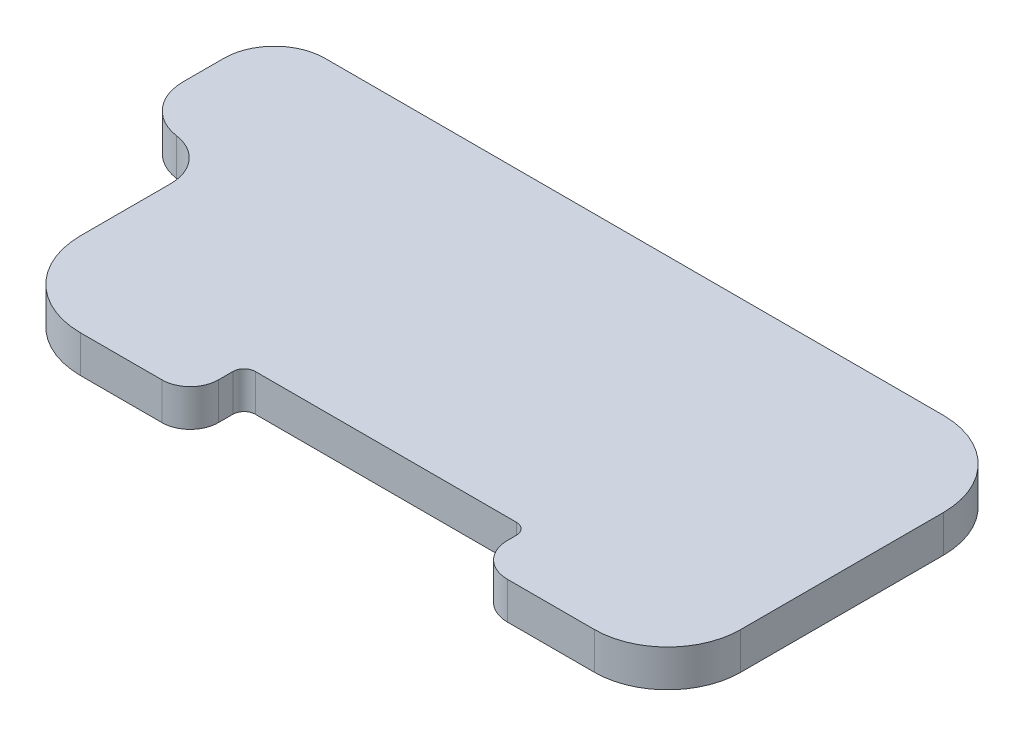
ISO-10303-21;
HEADER;
FILE_DESCRIPTION(('STEP AP214'),'2;1');
FILE_NAME('part.step','',(''),(''),'','','');
FILE_SCHEMA(('AUTOMOTIVE_DESIGN { 1 0 10303 214 1 1 1 1 }'));
ENDSEC;
DATA;
#1=APPLICATION_CONTEXT('core data for automotive mechanical design processes');
#2=APPLICATION_PROTOCOL_DEFINITION('international standard','automotive_design',2000,#1);
#3=PRODUCT_CONTEXT('',#1,'mechanical');
#4=PRODUCT('Part','Part','',(#3));
#5=PRODUCT_RELATED_PRODUCT_CATEGORY('part','',(#4));
#6=PRODUCT_DEFINITION_FORMATION('','',#4);
#7=PRODUCT_DEFINITION_CONTEXT('part definition',#1,'design');
#8=PRODUCT_DEFINITION('design','',#6,#7);
#9=PRODUCT_DEFINITION_SHAPE('','',#8);
#10=(LENGTH_UNIT() NAMED_UNIT(*) SI_UNIT(.MILLI.,.METRE.));
#11=(NAMED_UNIT(*) PLANE_ANGLE_UNIT() SI_UNIT($,.RADIAN.));
#12=(NAMED_UNIT(*) SI_UNIT($,.STERADIAN.) SOLID_ANGLE_UNIT());
#13=UNCERTAINTY_MEASURE_WITH_UNIT(LENGTH_MEASURE(1.E-05),#10,'distance_accuracy_value','');
#14=(GEOMETRIC_REPRESENTATION_CONTEXT(3) GLOBAL_UNCERTAINTY_ASSIGNED_CONTEXT((#13)) GLOBAL_UNIT_ASSIGNED_CONTEXT((#10,
#11,#12)) REPRESENTATION_CONTEXT('',''));
#15=CARTESIAN_POINT('',(0.,0.,0.));
#16=DIRECTION('',(0.,0.,1.));
#17=DIRECTION('',(1.,0.,0.));
#18=AXIS2_PLACEMENT_3D('',#15,#16,#17);
#19=CARTESIAN_POINT('',(0.,1.32,-5.05));
#20=DIRECTION('',(1.,0.,0.));
#21=DIRECTION('',(0.,0.,-1.));
#22=AXIS2_PLACEMENT_3D('',#19,#20,#21);
#23=PLANE('',#22);
#24=DIRECTION('',(0.,0.,1.));
#25=VECTOR('',#24,1.);
#26=CARTESIAN_POINT('',(0.,1.32,-5.05));
#27=LINE('',#26,#25);
#28=CARTESIAN_POINT('',(0.,1.32,-3.25));
#29=VERTEX_POINT('',#28);
#30=CARTESIAN_POINT('',(0.,1.32,-1.8));
#31=VERTEX_POINT('',#30);
#32=EDGE_CURVE('E209',#29,#31,#27,.T.);
#33=ORIENTED_EDGE('',*,*,#32,.F.);
#34=DIRECTION('',(0.,-1.,0.));
#35=VECTOR('',#34,1.);
#36=CARTESIAN_POINT('',(0.,1.32,-3.25));
#37=LINE('',#36,#35);
#38=CARTESIAN_POINT('',(0.,0.,-3.25));
#39=VERTEX_POINT('',#38);
#40=EDGE_CURVE('E274',#29,#39,#37,.T.);
#41=ORIENTED_EDGE('',*,*,#40,.T.);
#42=DIRECTION('',(0.,0.,1.));
#43=VECTOR('',#42,1.);
#44=CARTESIAN_POINT('',(0.,0.,-5.05));
#45=LINE('',#44,#43);
#46=CARTESIAN_POINT('',(0.,0.,-1.8));
#47=VERTEX_POINT('',#46);
#48=EDGE_CURVE('E195',#39,#47,#45,.T.);
#49=ORIENTED_EDGE('',*,*,#48,.T.);
#50=DIRECTION('',(0.,-1.,0.));
#51=VECTOR('',#50,1.);
#52=CARTESIAN_POINT('',(0.,1.32,-1.8));
#53=LINE('',#52,#51);
#54=EDGE_CURVE('E272',#47,#31,#53,.F.);
#55=ORIENTED_EDGE('',*,*,#54,.T.);
#56=EDGE_LOOP('',(#33,#41,#49,#55));
#57=FACE_BOUND('',#56,.T.);
#58=ADVANCED_FACE('F34',(#57),#23,.F.);
#59=CARTESIAN_POINT('',(2.92,1.32,0.));
#60=DIRECTION('',(1.,0.,0.));
#61=DIRECTION('',(0.,0.,-1.));
#62=AXIS2_PLACEMENT_3D('',#59,#60,#61);
#63=PLANE('',#62);
#64=DIRECTION('',(0.,0.,1.));
#65=VECTOR('',#64,1.);
#66=CARTESIAN_POINT('',(2.92,1.32,0.));
#67=LINE('',#66,#65);
#68=CARTESIAN_POINT('',(2.92,1.32,1.56594711782583));
#69=VERTEX_POINT('',#68);
#70=CARTESIAN_POINT('',(2.92,1.32,4.77));
#71=VERTEX_POINT('',#70);
#72=EDGE_CURVE('E294',#69,#71,#67,.T.);
#73=ORIENTED_EDGE('',*,*,#72,.F.);
#74=DIRECTION('',(0.,-1.,0.));
#75=VECTOR('',#74,1.);
#76=CARTESIAN_POINT('',(2.92,1.32,1.56594711782583));
#77=LINE('',#76,#75);
#78=CARTESIAN_POINT('',(2.92,0.,1.56594711782583));
#79=VERTEX_POINT('',#78);
#80=EDGE_CURVE('E287',#69,#79,#77,.T.);
#81=ORIENTED_EDGE('',*,*,#80,.T.);
#82=DIRECTION('',(0.,0.,1.));
#83=VECTOR('',#82,1.);
#84=CARTESIAN_POINT('',(2.92,0.,0.));
#85=LINE('',#84,#83);
#86=CARTESIAN_POINT('',(2.92,0.,4.77));
#87=VERTEX_POINT('',#86);
#88=EDGE_CURVE('E190',#79,#87,#85,.T.);
#89=ORIENTED_EDGE('',*,*,#88,.T.);
#90=DIRECTION('',(0.,-1.,0.));
#91=VECTOR('',#90,1.);
#92=CARTESIAN_POINT('',(2.92,1.32,4.77));
#93=LINE('',#92,#91);
#94=EDGE_CURVE('E171',#87,#71,#93,.F.);
#95=ORIENTED_EDGE('',*,*,#94,.T.);
#96=EDGE_LOOP('',(#73,#81,#89,#95));
#97=FACE_BOUND('',#96,.T.);
#98=ADVANCED_FACE('F293',(#97),#63,.F.);
#99=CARTESIAN_POINT('',(2.92,1.32,7.77));
#100=DIRECTION('',(0.,0.,-1.));
#101=DIRECTION('',(-1.,0.,0.));
#102=AXIS2_PLACEMENT_3D('',#99,#100,#101);
#103=PLANE('',#102);
#104=DIRECTION('',(1.,0.,0.));
#105=VECTOR('',#104,1.);
#106=CARTESIAN_POINT('',(2.92,0.,7.77));
#107=LINE('',#106,#105);
#108=CARTESIAN_POINT('',(5.92,0.,7.77));
#109=VERTEX_POINT('',#108);
#110=CARTESIAN_POINT('',(8.82,0.,7.77));
#111=VERTEX_POINT('',#110);
#112=EDGE_CURVE('E179',#109,#111,#107,.T.);
#113=ORIENTED_EDGE('',*,*,#112,.T.);
#114=DIRECTION('',(0.,-1.,0.));
#115=VECTOR('',#114,1.);
#116=CARTESIAN_POINT('',(8.82000000000001,1.32,7.77));
#117=LINE('',#116,#115);
#118=CARTESIAN_POINT('',(8.82,1.32,7.77));
#119=VERTEX_POINT('',#118);
#120=EDGE_CURVE('E242',#111,#119,#117,.F.);
#121=ORIENTED_EDGE('',*,*,#120,.T.);
#122=DIRECTION('',(1.,0.,0.));
#123=VECTOR('',#122,1.);
#124=CARTESIAN_POINT('',(2.92,1.32,7.77));
#125=LINE('',#124,#123);
#126=CARTESIAN_POINT('',(5.92,1.32,7.77));
#127=VERTEX_POINT('',#126);
#128=EDGE_CURVE('E182',#127,#119,#125,.T.);
#129=ORIENTED_EDGE('',*,*,#128,.F.);
#130=DIRECTION('',(0.,-1.,0.));
#131=VECTOR('',#130,1.);
#132=CARTESIAN_POINT('',(5.92,1.32,7.77));
#133=LINE('',#132,#131);
#134=EDGE_CURVE('E169',#127,#109,#133,.T.);
#135=ORIENTED_EDGE('',*,*,#134,.T.);
#136=EDGE_LOOP('',(#113,#121,#129,#135));
#137=FACE_BOUND('',#136,.T.);
#138=ADVANCED_FACE('F178',(#137),#103,.F.);
#139=CARTESIAN_POINT('',(9.82,1.32,7.77));
#140=DIRECTION('',(-1.,0.,0.));
#141=DIRECTION('',(0.,0.,1.));
#142=AXIS2_PLACEMENT_3D('',#139,#140,#141);
#143=PLANE('',#142);
#144=DIRECTION('',(0.,0.,-1.));
#145=VECTOR('',#144,1.);
#146=CARTESIAN_POINT('',(9.82,0.,7.77));
#147=LINE('',#146,#145);
#148=CARTESIAN_POINT('',(9.82,0.,6.77));
#149=VERTEX_POINT('',#148);
#150=CARTESIAN_POINT('',(9.82,0.,6.25));
#151=VERTEX_POINT('',#150);
#152=EDGE_CURVE('E189',#149,#151,#147,.T.);
#153=ORIENTED_EDGE('',*,*,#152,.T.);
#154=DIRECTION('',(0.,-1.,0.));
#155=VECTOR('',#154,1.);
#156=CARTESIAN_POINT('',(9.82,1.32,6.25));
#157=LINE('',#156,#155);
#158=CARTESIAN_POINT('',(9.82,1.32,6.25));
#159=VERTEX_POINT('',#158);
#160=EDGE_CURVE('E259',#151,#159,#157,.F.);
#161=ORIENTED_EDGE('',*,*,#160,.T.);
#162=DIRECTION('',(0.,0.,-1.));
#163=VECTOR('',#162,1.);
#164=CARTESIAN_POINT('',(9.82,1.32,7.77));
#165=LINE('',#164,#163);
#166=CARTESIAN_POINT('',(9.82,1.32,6.77));
#167=VERTEX_POINT('',#166);
#168=EDGE_CURVE('E318',#167,#159,#165,.T.);
#169=ORIENTED_EDGE('',*,*,#168,.F.);
#170=DIRECTION('',(0.,-1.,0.));
#171=VECTOR('',#170,1.);
#172=CARTESIAN_POINT('',(9.82,1.32,6.77));
#173=LINE('',#172,#171);
#174=EDGE_CURVE('E235',#167,#149,#173,.T.);
#175=ORIENTED_EDGE('',*,*,#174,.T.);
#176=EDGE_LOOP('',(#153,#161,#169,#175));
#177=FACE_BOUND('',#176,.T.);
#178=ADVANCED_FACE('F329',(#177),#143,.F.);
#179=CARTESIAN_POINT('',(9.82,1.32,5.85));
#180=DIRECTION('',(0.,0.,-1.));
#181=DIRECTION('',(-1.,0.,0.));
#182=AXIS2_PLACEMENT_3D('',#179,#180,#181);
#183=PLANE('',#182);
#184=DIRECTION('',(1.,0.,0.));
#185=VECTOR('',#184,1.);
#186=CARTESIAN_POINT('',(9.82,1.32,5.85));
#187=LINE('',#186,#185);
#188=CARTESIAN_POINT('',(10.22,1.32,5.85));
#189=VERTEX_POINT('',#188);
#190=CARTESIAN_POINT('',(19.52,1.32,5.85));
#191=VERTEX_POINT('',#190);
#192=EDGE_CURVE('E315',#189,#191,#187,.T.);
#193=ORIENTED_EDGE('',*,*,#192,.F.);
#194=DIRECTION('',(0.,-1.,0.));
#195=VECTOR('',#194,1.);
#196=CARTESIAN_POINT('',(10.22,0.,5.85));
#197=LINE('',#196,#195);
#198=CARTESIAN_POINT('',(10.22,0.,5.85));
#199=VERTEX_POINT('',#198);
#200=EDGE_CURVE('E256',#189,#199,#197,.T.);
#201=ORIENTED_EDGE('',*,*,#200,.T.);
#202=DIRECTION('',(1.,0.,0.));
#203=VECTOR('',#202,1.);
#204=CARTESIAN_POINT('',(9.82,0.,5.85));
#205=LINE('',#204,#203);
#206=CARTESIAN_POINT('',(19.52,0.,5.85));
#207=VERTEX_POINT('',#206);
#208=EDGE_CURVE('E193',#199,#207,#205,.T.);
#209=ORIENTED_EDGE('',*,*,#208,.T.);
#210=DIRECTION('',(0.,-1.,0.));
#211=VECTOR('',#210,1.);
#212=CARTESIAN_POINT('',(19.52,1.32,5.85));
#213=LINE('',#212,#211);
#214=EDGE_CURVE('E254',#207,#191,#213,.F.);
#215=ORIENTED_EDGE('',*,*,#214,.T.);
#216=EDGE_LOOP('',(#193,#201,#209,#215));
#217=FACE_BOUND('',#216,.T.);
#218=ADVANCED_FACE('F338',(#217),#183,.F.);
#219=CARTESIAN_POINT('',(19.92,1.32,5.85));
#220=DIRECTION('',(1.,0.,0.));
#221=DIRECTION('',(0.,0.,-1.));
#222=AXIS2_PLACEMENT_3D('',#219,#220,#221);
#223=PLANE('',#222);
#224=DIRECTION('',(0.,0.,1.));
#225=VECTOR('',#224,1.);
#226=CARTESIAN_POINT('',(19.92,1.32,5.85));
#227=LINE('',#226,#225);
#228=CARTESIAN_POINT('',(19.92,1.32,6.25));
#229=VERTEX_POINT('',#228);
#230=CARTESIAN_POINT('',(19.92,1.32,6.56999999999999));
#231=VERTEX_POINT('',#230);
#232=EDGE_CURVE('E313',#229,#231,#227,.T.);
#233=ORIENTED_EDGE('',*,*,#232,.F.);
#234=DIRECTION('',(0.,-1.,0.));
#235=VECTOR('',#234,1.);
#236=CARTESIAN_POINT('',(19.92,0.,6.25));
#237=LINE('',#236,#235);
#238=CARTESIAN_POINT('',(19.92,0.,6.25));
#239=VERTEX_POINT('',#238);
#240=EDGE_CURVE('E261',#229,#239,#237,.T.);
#241=ORIENTED_EDGE('',*,*,#240,.T.);
#242=DIRECTION('',(0.,0.,1.));
#243=VECTOR('',#242,1.);
#244=CARTESIAN_POINT('',(19.92,0.,5.85));
#245=LINE('',#244,#243);
#246=CARTESIAN_POINT('',(19.92,0.,6.56999999999999));
#247=VERTEX_POINT('',#246);
#248=EDGE_CURVE('E201',#239,#247,#245,.T.);
#249=ORIENTED_EDGE('',*,*,#248,.T.);
#250=DIRECTION('',(0.,-1.,0.));
#251=VECTOR('',#250,1.);
#252=CARTESIAN_POINT('',(19.92,1.32,6.56999999999999));
#253=LINE('',#252,#251);
#254=EDGE_CURVE('E251',#247,#231,#253,.F.);
#255=ORIENTED_EDGE('',*,*,#254,.T.);
#256=EDGE_LOOP('',(#233,#241,#249,#255));
#257=FACE_BOUND('',#256,.T.);
#258=ADVANCED_FACE('F347',(#257),#223,.F.);
#259=CARTESIAN_POINT('',(19.92,1.32,7.77));
#260=DIRECTION('',(0.,0.,-1.));
#261=DIRECTION('',(-1.,0.,0.));
#262=AXIS2_PLACEMENT_3D('',#259,#260,#261);
#263=PLANE('',#262);
#264=DIRECTION('',(1.,0.,0.));
#265=VECTOR('',#264,1.);
#266=CARTESIAN_POINT('',(19.92,1.32,7.77));
#267=LINE('',#266,#265);
#268=CARTESIAN_POINT('',(21.12,1.32,7.77));
#269=VERTEX_POINT('',#268);
#270=CARTESIAN_POINT('',(24.22,1.32,7.77));
#271=VERTEX_POINT('',#270);
#272=EDGE_CURVE('E311',#269,#271,#267,.T.);
#273=ORIENTED_EDGE('',*,*,#272,.F.);
#274=DIRECTION('',(0.,-1.,0.));
#275=VECTOR('',#274,1.);
#276=CARTESIAN_POINT('',(21.12,1.32,7.77));
#277=LINE('',#276,#275);
#278=CARTESIAN_POINT('',(21.12,0.,7.77));
#279=VERTEX_POINT('',#278);
#280=EDGE_CURVE('E248',#269,#279,#277,.T.);
#281=ORIENTED_EDGE('',*,*,#280,.T.);
#282=DIRECTION('',(1.,0.,0.));
#283=VECTOR('',#282,1.);
#284=CARTESIAN_POINT('',(19.92,0.,7.77));
#285=LINE('',#284,#283);
#286=CARTESIAN_POINT('',(24.22,0.,7.77));
#287=VERTEX_POINT('',#286);
#288=EDGE_CURVE('E203',#279,#287,#285,.T.);
#289=ORIENTED_EDGE('',*,*,#288,.T.);
#290=DIRECTION('',(0.,-1.,0.));
#291=VECTOR('',#290,1.);
#292=CARTESIAN_POINT('',(24.22,1.32,7.77));
#293=LINE('',#292,#291);
#294=EDGE_CURVE('E230',#287,#271,#293,.F.);
#295=ORIENTED_EDGE('',*,*,#294,.T.);
#296=EDGE_LOOP('',(#273,#281,#289,#295));
#297=FACE_BOUND('',#296,.T.);
#298=ADVANCED_FACE('F356',(#297),#263,.F.);
#299=CARTESIAN_POINT('',(26.82,1.32,7.77));
#300=DIRECTION('',(-1.,0.,0.));
#301=DIRECTION('',(0.,0.,1.));
#302=AXIS2_PLACEMENT_3D('',#299,#300,#301);
#303=PLANE('',#302);
#304=DIRECTION('',(0.,0.,-1.));
#305=VECTOR('',#304,1.);
#306=CARTESIAN_POINT('',(26.82,1.32,7.77));
#307=LINE('',#306,#305);
#308=CARTESIAN_POINT('',(26.82,1.32,5.17));
#309=VERTEX_POINT('',#308);
#310=CARTESIAN_POINT('',(26.82,1.32,-2.05));
#311=VERTEX_POINT('',#310);
#312=EDGE_CURVE('E309',#309,#311,#307,.T.);
#313=ORIENTED_EDGE('',*,*,#312,.F.);
#314=DIRECTION('',(0.,-1.,0.));
#315=VECTOR('',#314,1.);
#316=CARTESIAN_POINT('',(26.82,1.32,5.17));
#317=LINE('',#316,#315);
#318=CARTESIAN_POINT('',(26.82,0.,5.17));
#319=VERTEX_POINT('',#318);
#320=EDGE_CURVE('E224',#309,#319,#317,.T.);
#321=ORIENTED_EDGE('',*,*,#320,.T.);
#322=DIRECTION('',(0.,0.,-1.));
#323=VECTOR('',#322,1.);
#324=CARTESIAN_POINT('',(26.82,0.,7.77));
#325=LINE('',#324,#323);
#326=CARTESIAN_POINT('',(26.82,0.,-2.05));
#327=VERTEX_POINT('',#326);
#328=EDGE_CURVE('E205',#319,#327,#325,.T.);
#329=ORIENTED_EDGE('',*,*,#328,.T.);
#330=DIRECTION('',(0.,-1.,0.));
#331=VECTOR('',#330,1.);
#332=CARTESIAN_POINT('',(26.82,1.32,-2.05));
#333=LINE('',#332,#331);
#334=EDGE_CURVE('E221',#327,#311,#333,.F.);
#335=ORIENTED_EDGE('',*,*,#334,.T.);
#336=EDGE_LOOP('',(#313,#321,#329,#335));
#337=FACE_BOUND('',#336,.T.);
#338=ADVANCED_FACE('F364',(#337),#303,.F.);
#339=CARTESIAN_POINT('',(26.82,1.32,-5.05));
#340=DIRECTION('',(0.,0.,1.));
#341=DIRECTION('',(1.,0.,0.));
#342=AXIS2_PLACEMENT_3D('',#339,#340,#341);
#343=PLANE('',#342);
#344=DIRECTION('',(-1.,0.,0.));
#345=VECTOR('',#344,1.);
#346=CARTESIAN_POINT('',(26.82,0.,-5.05));
#347=LINE('',#346,#345);
#348=CARTESIAN_POINT('',(23.82,0.,-5.05));
#349=VERTEX_POINT('',#348);
#350=CARTESIAN_POINT('',(1.80000000000001,0.,-5.05));
#351=VERTEX_POINT('',#350);
#352=EDGE_CURVE('E207',#349,#351,#347,.T.);
#353=ORIENTED_EDGE('',*,*,#352,.T.);
#354=DIRECTION('',(0.,-1.,0.));
#355=VECTOR('',#354,1.);
#356=CARTESIAN_POINT('',(1.8,1.32,-5.05));
#357=LINE('',#356,#355);
#358=CARTESIAN_POINT('',(1.80000000000001,1.32,-5.05));
#359=VERTEX_POINT('',#358);
#360=EDGE_CURVE('E281',#351,#359,#357,.F.);
#361=ORIENTED_EDGE('',*,*,#360,.T.);
#362=DIRECTION('',(-1.,0.,0.));
#363=VECTOR('',#362,1.);
#364=CARTESIAN_POINT('',(26.82,1.32,-5.05));
#365=LINE('',#364,#363);
#366=CARTESIAN_POINT('',(23.82,1.32,-5.05));
#367=VERTEX_POINT('',#366);
#368=EDGE_CURVE('E183',#367,#359,#365,.T.);
#369=ORIENTED_EDGE('',*,*,#368,.F.);
#370=DIRECTION('',(0.,-1.,0.));
#371=VECTOR('',#370,1.);
#372=CARTESIAN_POINT('',(23.82,1.32,-5.05));
#373=LINE('',#372,#371);
#374=EDGE_CURVE('E218',#367,#349,#373,.T.);
#375=ORIENTED_EDGE('',*,*,#374,.T.);
#376=EDGE_LOOP('',(#353,#361,#369,#375));
#377=FACE_BOUND('',#376,.T.);
#378=ADVANCED_FACE('F374',(#377),#343,.F.);
#379=CARTESIAN_POINT('',(0.,1.32,0.));
#380=DIRECTION('',(0.,1.,0.));
#381=DIRECTION('',(0.,0.,1.));
#382=AXIS2_PLACEMENT_3D('',#379,#380,#381);
#383=PLANE('',#382);
#384=ORIENTED_EDGE('',*,*,#368,.T.);
#385=CARTESIAN_POINT('',(1.8,1.32,-3.25));
#386=DIRECTION('',(0.,1.,0.));
#387=DIRECTION('',(0.,0.,1.));
#388=AXIS2_PLACEMENT_3D('',#385,#386,#387);
#389=CIRCLE('',#388,1.8);
#390=EDGE_CURVE('E285',#359,#29,#389,.T.);
#391=ORIENTED_EDGE('',*,*,#390,.T.);
#392=ORIENTED_EDGE('',*,*,#32,.T.);
#393=CARTESIAN_POINT('',(1.8,1.32,-1.8));
#394=DIRECTION('',(0.,1.,0.));
#395=DIRECTION('',(0.,0.,1.));
#396=AXIS2_PLACEMENT_3D('',#393,#394,#395);
#397=CIRCLE('',#396,1.8);
#398=CARTESIAN_POINT('',(1.54588235294118,1.32,-0.0180279964451496));
#399=VERTEX_POINT('',#398);
#400=EDGE_CURVE('E283',#31,#399,#397,.T.);
#401=ORIENTED_EDGE('',*,*,#400,.T.);
#402=CARTESIAN_POINT('',(1.32,1.32,1.56594711782583));
#403=DIRECTION('',(0.,1.,0.));
#404=DIRECTION('',(0.,0.,1.));
#405=AXIS2_PLACEMENT_3D('',#402,#403,#404);
#406=CIRCLE('',#405,1.6);
#407=EDGE_CURVE('E12',#399,#69,#406,.F.);
#408=ORIENTED_EDGE('',*,*,#407,.T.);
#409=ORIENTED_EDGE('',*,*,#72,.T.);
#410=CARTESIAN_POINT('',(5.92,1.32,4.77));
#411=DIRECTION('',(0.,1.,0.));
#412=DIRECTION('',(0.,0.,1.));
#413=AXIS2_PLACEMENT_3D('',#410,#411,#412);
#414=CIRCLE('',#413,3.);
#415=EDGE_CURVE('E216',#71,#127,#414,.T.);
#416=ORIENTED_EDGE('',*,*,#415,.T.);
#417=ORIENTED_EDGE('',*,*,#128,.T.);
#418=CARTESIAN_POINT('',(8.82000000000001,1.32,6.77));
#419=DIRECTION('',(0.,1.,0.));
#420=DIRECTION('',(0.,0.,1.));
#421=AXIS2_PLACEMENT_3D('',#418,#419,#420);
#422=CIRCLE('',#421,1.);
#423=EDGE_CURVE('E246',#119,#167,#422,.T.);
#424=ORIENTED_EDGE('',*,*,#423,.T.);
#425=ORIENTED_EDGE('',*,*,#168,.T.);
#426=CARTESIAN_POINT('',(10.22,1.32,6.25));
#427=DIRECTION('',(0.,1.,0.));
#428=DIRECTION('',(0.,0.,1.));
#429=AXIS2_PLACEMENT_3D('',#426,#427,#428);
#430=CIRCLE('',#429,0.4);
#431=EDGE_CURVE('E266',#159,#189,#430,.F.);
#432=ORIENTED_EDGE('',*,*,#431,.T.);
#433=ORIENTED_EDGE('',*,*,#192,.T.);
#434=CARTESIAN_POINT('',(19.52,1.32,6.25));
#435=DIRECTION('',(0.,1.,0.));
#436=DIRECTION('',(0.,0.,1.));
#437=AXIS2_PLACEMENT_3D('',#434,#435,#436);
#438=CIRCLE('',#437,0.4);
#439=EDGE_CURVE('E270',#191,#229,#438,.F.);
#440=ORIENTED_EDGE('',*,*,#439,.T.);
#441=ORIENTED_EDGE('',*,*,#232,.T.);
#442=CARTESIAN_POINT('',(21.12,1.32,6.57));
#443=DIRECTION('',(0.,1.,0.));
#444=DIRECTION('',(0.,0.,1.));
#445=AXIS2_PLACEMENT_3D('',#442,#443,#444);
#446=CIRCLE('',#445,1.2);
#447=EDGE_CURVE('E244',#231,#269,#446,.T.);
#448=ORIENTED_EDGE('',*,*,#447,.T.);
#449=ORIENTED_EDGE('',*,*,#272,.T.);
#450=CARTESIAN_POINT('',(24.22,1.32,5.17));
#451=DIRECTION('',(0.,1.,0.));
#452=DIRECTION('',(0.,0.,1.));
#453=AXIS2_PLACEMENT_3D('',#450,#451,#452);
#454=CIRCLE('',#453,2.6);
#455=EDGE_CURVE('E233',#271,#309,#454,.T.);
#456=ORIENTED_EDGE('',*,*,#455,.T.);
#457=ORIENTED_EDGE('',*,*,#312,.T.);
#458=CARTESIAN_POINT('',(23.82,1.32,-2.05));
#459=DIRECTION('',(0.,1.,0.));
#460=DIRECTION('',(0.,0.,1.));
#461=AXIS2_PLACEMENT_3D('',#458,#459,#460);
#462=CIRCLE('',#461,3.);
#463=EDGE_CURVE('E214',#311,#367,#462,.T.);
#464=ORIENTED_EDGE('',*,*,#463,.T.);
#465=EDGE_LOOP('',(#384,#391,#392,#401,#408,#409,#416,#417,#424,#425,#432,#433,#440,#441,#448,
#449,#456,#457,#464));
#466=FACE_BOUND('',#465,.T.);
#467=ADVANCED_FACE('F299',(#466),#383,.T.);
#468=CARTESIAN_POINT('',(0.,0.,0.));
#469=DIRECTION('',(0.,1.,0.));
#470=DIRECTION('',(0.,0.,1.));
#471=AXIS2_PLACEMENT_3D('',#468,#469,#470);
#472=PLANE('',#471);
#473=ORIENTED_EDGE('',*,*,#48,.F.);
#474=CARTESIAN_POINT('',(1.8,0.,-3.25));
#475=DIRECTION('',(0.,1.,0.));
#476=DIRECTION('',(0.,0.,1.));
#477=AXIS2_PLACEMENT_3D('',#474,#475,#476);
#478=CIRCLE('',#477,1.8);
#479=EDGE_CURVE('E279',#39,#351,#478,.F.);
#480=ORIENTED_EDGE('',*,*,#479,.T.);
#481=ORIENTED_EDGE('',*,*,#352,.F.);
#482=CARTESIAN_POINT('',(23.82,0.,-2.05));
#483=DIRECTION('',(0.,1.,0.));
#484=DIRECTION('',(0.,0.,1.));
#485=AXIS2_PLACEMENT_3D('',#482,#483,#484);
#486=CIRCLE('',#485,3.);
#487=EDGE_CURVE('E173',#349,#327,#486,.F.);
#488=ORIENTED_EDGE('',*,*,#487,.T.);
#489=ORIENTED_EDGE('',*,*,#328,.F.);
#490=CARTESIAN_POINT('',(24.22,0.,5.17));
#491=DIRECTION('',(0.,1.,0.));
#492=DIRECTION('',(0.,0.,1.));
#493=AXIS2_PLACEMENT_3D('',#490,#491,#492);
#494=CIRCLE('',#493,2.6);
#495=EDGE_CURVE('E227',#319,#287,#494,.F.);
#496=ORIENTED_EDGE('',*,*,#495,.T.);
#497=ORIENTED_EDGE('',*,*,#288,.F.);
#498=CARTESIAN_POINT('',(21.12,0.,6.57));
#499=DIRECTION('',(0.,1.,0.));
#500=DIRECTION('',(0.,0.,1.));
#501=AXIS2_PLACEMENT_3D('',#498,#499,#500);
#502=CIRCLE('',#501,1.2);
#503=EDGE_CURVE('E238',#279,#247,#502,.F.);
#504=ORIENTED_EDGE('',*,*,#503,.T.);
#505=ORIENTED_EDGE('',*,*,#248,.F.);
#506=CARTESIAN_POINT('',(19.52,0.,6.25));
#507=DIRECTION('',(0.,1.,0.));
#508=DIRECTION('',(0.,0.,1.));
#509=AXIS2_PLACEMENT_3D('',#506,#507,#508);
#510=CIRCLE('',#509,0.4);
#511=EDGE_CURVE('E268',#239,#207,#510,.T.);
#512=ORIENTED_EDGE('',*,*,#511,.T.);
#513=ORIENTED_EDGE('',*,*,#208,.F.);
#514=CARTESIAN_POINT('',(10.22,0.,6.25));
#515=DIRECTION('',(0.,1.,0.));
#516=DIRECTION('',(0.,0.,1.));
#517=AXIS2_PLACEMENT_3D('',#514,#515,#516);
#518=CIRCLE('',#517,0.4);
#519=EDGE_CURVE('E264',#199,#151,#518,.T.);
#520=ORIENTED_EDGE('',*,*,#519,.T.);
#521=ORIENTED_EDGE('',*,*,#152,.F.);
#522=CARTESIAN_POINT('',(8.82000000000001,0.,6.77));
#523=DIRECTION('',(0.,1.,0.));
#524=DIRECTION('',(0.,0.,1.));
#525=AXIS2_PLACEMENT_3D('',#522,#523,#524);
#526=CIRCLE('',#525,1.);
#527=EDGE_CURVE('E188',#149,#111,#526,.F.);
#528=ORIENTED_EDGE('',*,*,#527,.T.);
#529=ORIENTED_EDGE('',*,*,#112,.F.);
#530=CARTESIAN_POINT('',(5.92,0.,4.77));
#531=DIRECTION('',(0.,1.,0.));
#532=DIRECTION('',(0.,0.,1.));
#533=AXIS2_PLACEMENT_3D('',#530,#531,#532);
#534=CIRCLE('',#533,3.);
#535=EDGE_CURVE('E165',#109,#87,#534,.F.);
#536=ORIENTED_EDGE('',*,*,#535,.T.);
#537=ORIENTED_EDGE('',*,*,#88,.F.);
#538=CARTESIAN_POINT('',(1.32,0.,1.56594711782583));
#539=DIRECTION('',(0.,1.,0.));
#540=DIRECTION('',(0.,0.,1.));
#541=AXIS2_PLACEMENT_3D('',#538,#539,#540);
#542=CIRCLE('',#541,1.6);
#543=CARTESIAN_POINT('',(1.54588235294118,0.,-0.0180279964451496));
#544=VERTEX_POINT('',#543);
#545=EDGE_CURVE('E42',#79,#544,#542,.T.);
#546=ORIENTED_EDGE('',*,*,#545,.T.);
#547=CARTESIAN_POINT('',(1.8,0.,-1.8));
#548=DIRECTION('',(0.,1.,0.));
#549=DIRECTION('',(0.,0.,1.));
#550=AXIS2_PLACEMENT_3D('',#547,#548,#549);
#551=CIRCLE('',#550,1.8);
#552=EDGE_CURVE('E277',#544,#47,#551,.F.);
#553=ORIENTED_EDGE('',*,*,#552,.T.);
#554=EDGE_LOOP('',(#473,#480,#481,#488,#489,#496,#497,#504,#505,#512,#513,#520,#521,#528,#529,
#536,#537,#546,#553));
#555=FACE_BOUND('',#554,.T.);
#556=ADVANCED_FACE('F186',(#555),#472,.F.);
#557=CARTESIAN_POINT('',(5.92,1.32,4.77));
#558=DIRECTION('',(0.,-1.,0.));
#559=DIRECTION('',(0.,0.,-1.));
#560=AXIS2_PLACEMENT_3D('',#557,#558,#559);
#561=CYLINDRICAL_SURFACE('',#560,3.);
#562=ORIENTED_EDGE('',*,*,#415,.F.);
#563=ORIENTED_EDGE('',*,*,#94,.F.);
#564=ORIENTED_EDGE('',*,*,#535,.F.);
#565=ORIENTED_EDGE('',*,*,#134,.F.);
#566=EDGE_LOOP('',(#562,#563,#564,#565));
#567=FACE_BOUND('',#566,.T.);
#568=ADVANCED_FACE('F168',(#567),#561,.T.);
#569=CARTESIAN_POINT('',(23.82,1.32,-2.05));
#570=DIRECTION('',(0.,-1.,0.));
#571=DIRECTION('',(0.,0.,-1.));
#572=AXIS2_PLACEMENT_3D('',#569,#570,#571);
#573=CYLINDRICAL_SURFACE('',#572,3.);
#574=ORIENTED_EDGE('',*,*,#463,.F.);
#575=ORIENTED_EDGE('',*,*,#334,.F.);
#576=ORIENTED_EDGE('',*,*,#487,.F.);
#577=ORIENTED_EDGE('',*,*,#374,.F.);
#578=EDGE_LOOP('',(#574,#575,#576,#577));
#579=FACE_BOUND('',#578,.T.);
#580=ADVANCED_FACE('F370',(#579),#573,.T.);
#581=CARTESIAN_POINT('',(24.22,1.32,5.17));
#582=DIRECTION('',(0.,-1.,0.));
#583=DIRECTION('',(0.,0.,-1.));
#584=AXIS2_PLACEMENT_3D('',#581,#582,#583);
#585=CYLINDRICAL_SURFACE('',#584,2.6);
#586=ORIENTED_EDGE('',*,*,#455,.F.);
#587=ORIENTED_EDGE('',*,*,#294,.F.);
#588=ORIENTED_EDGE('',*,*,#495,.F.);
#589=ORIENTED_EDGE('',*,*,#320,.F.);
#590=EDGE_LOOP('',(#586,#587,#588,#589));
#591=FACE_BOUND('',#590,.T.);
#592=ADVANCED_FACE('F361',(#591),#585,.T.);
#593=CARTESIAN_POINT('',(8.82000000000001,1.32,6.77));
#594=DIRECTION('',(0.,-1.,0.));
#595=DIRECTION('',(0.,0.,-1.));
#596=AXIS2_PLACEMENT_3D('',#593,#594,#595);
#597=CYLINDRICAL_SURFACE('',#596,1.);
#598=ORIENTED_EDGE('',*,*,#423,.F.);
#599=ORIENTED_EDGE('',*,*,#120,.F.);
#600=ORIENTED_EDGE('',*,*,#527,.F.);
#601=ORIENTED_EDGE('',*,*,#174,.F.);
#602=EDGE_LOOP('',(#598,#599,#600,#601));
#603=FACE_BOUND('',#602,.T.);
#604=ADVANCED_FACE('F327',(#603),#597,.T.);
#605=CARTESIAN_POINT('',(21.12,1.32,6.57));
#606=DIRECTION('',(0.,-1.,0.));
#607=DIRECTION('',(0.,0.,-1.));
#608=AXIS2_PLACEMENT_3D('',#605,#606,#607);
#609=CYLINDRICAL_SURFACE('',#608,1.2);
#610=ORIENTED_EDGE('',*,*,#447,.F.);
#611=ORIENTED_EDGE('',*,*,#254,.F.);
#612=ORIENTED_EDGE('',*,*,#503,.F.);
#613=ORIENTED_EDGE('',*,*,#280,.F.);
#614=EDGE_LOOP('',(#610,#611,#612,#613));
#615=FACE_BOUND('',#614,.T.);
#616=ADVANCED_FACE('F353',(#615),#609,.T.);
#617=CARTESIAN_POINT('',(10.22,1.32,6.25));
#618=DIRECTION('',(0.,1.,0.));
#619=DIRECTION('',(0.,0.,1.));
#620=AXIS2_PLACEMENT_3D('',#617,#618,#619);
#621=CYLINDRICAL_SURFACE('',#620,0.4);
#622=ORIENTED_EDGE('',*,*,#431,.F.);
#623=ORIENTED_EDGE('',*,*,#160,.F.);
#624=ORIENTED_EDGE('',*,*,#519,.F.);
#625=ORIENTED_EDGE('',*,*,#200,.F.);
#626=EDGE_LOOP('',(#622,#623,#624,#625));
#627=FACE_BOUND('',#626,.T.);
#628=ADVANCED_FACE('F335',(#627),#621,.F.);
#629=CARTESIAN_POINT('',(19.52,1.32,6.25));
#630=DIRECTION('',(0.,1.,0.));
#631=DIRECTION('',(0.,0.,1.));
#632=AXIS2_PLACEMENT_3D('',#629,#630,#631);
#633=CYLINDRICAL_SURFACE('',#632,0.4);
#634=ORIENTED_EDGE('',*,*,#439,.F.);
#635=ORIENTED_EDGE('',*,*,#214,.F.);
#636=ORIENTED_EDGE('',*,*,#511,.F.);
#637=ORIENTED_EDGE('',*,*,#240,.F.);
#638=EDGE_LOOP('',(#634,#635,#636,#637));
#639=FACE_BOUND('',#638,.T.);
#640=ADVANCED_FACE('F344',(#639),#633,.F.);
#641=CARTESIAN_POINT('',(1.8,1.32,-3.25));
#642=DIRECTION('',(0.,-1.,0.));
#643=DIRECTION('',(0.,0.,-1.));
#644=AXIS2_PLACEMENT_3D('',#641,#642,#643);
#645=CYLINDRICAL_SURFACE('',#644,1.8);
#646=ORIENTED_EDGE('',*,*,#390,.F.);
#647=ORIENTED_EDGE('',*,*,#360,.F.);
#648=ORIENTED_EDGE('',*,*,#479,.F.);
#649=ORIENTED_EDGE('',*,*,#40,.F.);
#650=EDGE_LOOP('',(#646,#647,#648,#649));
#651=FACE_BOUND('',#650,.T.);
#652=ADVANCED_FACE('F378',(#651),#645,.T.);
#653=CARTESIAN_POINT('',(1.8,1.32,-1.8));
#654=DIRECTION('',(0.,-1.,0.));
#655=DIRECTION('',(0.,0.,-1.));
#656=AXIS2_PLACEMENT_3D('',#653,#654,#655);
#657=CYLINDRICAL_SURFACE('',#656,1.8);
#658=ORIENTED_EDGE('',*,*,#552,.F.);
#659=DIRECTION('',(0.,-1.,0.));
#660=VECTOR('',#659,1.);
#661=CARTESIAN_POINT('',(1.54588235294118,1.32,-0.0180279964451496));
#662=LINE('',#661,#660);
#663=EDGE_CURVE('E55',#544,#399,#662,.F.);
#664=ORIENTED_EDGE('',*,*,#663,.T.);
#665=ORIENTED_EDGE('',*,*,#400,.F.);
#666=ORIENTED_EDGE('',*,*,#54,.F.);
#667=EDGE_LOOP('',(#658,#664,#665,#666));
#668=FACE_BOUND('',#667,.T.);
#669=ADVANCED_FACE('F303',(#668),#657,.T.);
#670=CARTESIAN_POINT('',(1.32,1.32,1.56594711782583));
#671=DIRECTION('',(0.,-1.,0.));
#672=DIRECTION('',(0.,0.,-1.));
#673=AXIS2_PLACEMENT_3D('',#670,#671,#672);
#674=CYLINDRICAL_SURFACE('',#673,1.6);
#675=ORIENTED_EDGE('',*,*,#407,.F.);
#676=ORIENTED_EDGE('',*,*,#663,.F.);
#677=ORIENTED_EDGE('',*,*,#545,.F.);
#678=ORIENTED_EDGE('',*,*,#80,.F.);
#679=EDGE_LOOP('',(#675,#676,#677,#678));
#680=FACE_BOUND('',#679,.T.);
#681=ADVANCED_FACE('F36',(#680),#674,.F.);
#682=CLOSED_SHELL('',(#58,#98,#138,#178,#218,#258,#298,#338,#378,#467,#556,#568,#580,#592,#604,
#616,#628,#640,#652,#669,#681));
#683=MANIFOLD_SOLID_BREP('B2',#682);
#684=ADVANCED_BREP_SHAPE_REPRESENTATION('',(#18,#683),#14);
#685=SHAPE_DEFINITION_REPRESENTATION(#9,#684);
ENDSEC;
END-ISO-10303-21;
